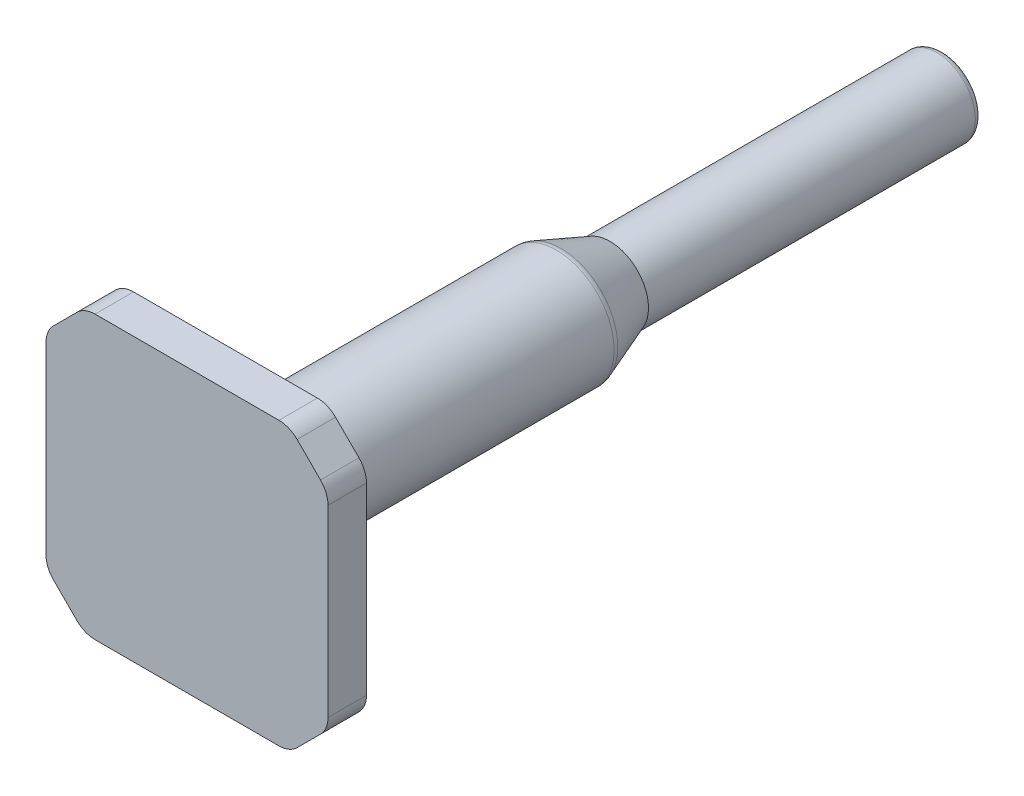
ISO-10303-21;
HEADER;
FILE_DESCRIPTION(('STEP AP214'),'2;1');
FILE_NAME('part.step','',(''),(''),'','','');
FILE_SCHEMA(('AUTOMOTIVE_DESIGN { 1 0 10303 214 1 1 1 1 }'));
ENDSEC;
DATA;
#1=APPLICATION_CONTEXT('core data for automotive mechanical design processes');
#2=APPLICATION_PROTOCOL_DEFINITION('international standard','automotive_design',2000,#1);
#3=PRODUCT_CONTEXT('',#1,'mechanical');
#4=PRODUCT('Part','Part','',(#3));
#5=PRODUCT_RELATED_PRODUCT_CATEGORY('part','',(#4));
#6=PRODUCT_DEFINITION_FORMATION('','',#4);
#7=PRODUCT_DEFINITION_CONTEXT('part definition',#1,'design');
#8=PRODUCT_DEFINITION('design','',#6,#7);
#9=PRODUCT_DEFINITION_SHAPE('','',#8);
#10=(LENGTH_UNIT() NAMED_UNIT(*) SI_UNIT(.MILLI.,.METRE.));
#11=(NAMED_UNIT(*) PLANE_ANGLE_UNIT() SI_UNIT($,.RADIAN.));
#12=(NAMED_UNIT(*) SI_UNIT($,.STERADIAN.) SOLID_ANGLE_UNIT());
#13=UNCERTAINTY_MEASURE_WITH_UNIT(LENGTH_MEASURE(1.E-05),#10,'distance_accuracy_value','');
#14=(GEOMETRIC_REPRESENTATION_CONTEXT(3) GLOBAL_UNCERTAINTY_ASSIGNED_CONTEXT((#13)) GLOBAL_UNIT_ASSIGNED_CONTEXT((#10,
#11,#12)) REPRESENTATION_CONTEXT('',''));
#15=CARTESIAN_POINT('',(0.,0.,0.));
#16=DIRECTION('',(0.,0.,1.));
#17=DIRECTION('',(1.,0.,0.));
#18=AXIS2_PLACEMENT_3D('',#15,#16,#17);
#19=CARTESIAN_POINT('',(0.,0.,0.));
#20=DIRECTION('',(0.,0.,1.));
#21=DIRECTION('',(1.,0.,0.));
#22=AXIS2_PLACEMENT_3D('',#19,#20,#21);
#23=PLANE('',#22);
#24=CARTESIAN_POINT('',(0.,0.,0.));
#25=DIRECTION('',(0.,0.,1.));
#26=DIRECTION('',(1.,0.,0.));
#27=AXIS2_PLACEMENT_3D('',#24,#25,#26);
#28=CIRCLE('',#27,5.);
#29=CARTESIAN_POINT('',(5.,0.,0.));
#30=VERTEX_POINT('',#29);
#31=EDGE_CURVE('E245',#30,#30,#28,.T.);
#32=ORIENTED_EDGE('',*,*,#31,.T.);
#33=EDGE_LOOP('',(#32));
#34=FACE_BOUND('',#33,.T.);
#35=DIRECTION('',(-0.707106781186549,-0.707106781186547,0.));
#36=VECTOR('',#35,1.);
#37=CARTESIAN_POINT('',(11.,-8.,0.));
#38=LINE('',#37,#36);
#39=CARTESIAN_POINT('',(10.4142135623731,-8.5857864376269,0.));
#40=VERTEX_POINT('',#39);
#41=CARTESIAN_POINT('',(8.5857864376269,-10.4142135623731,0.));
#42=VERTEX_POINT('',#41);
#43=EDGE_CURVE('E408',#40,#42,#38,.T.);
#44=ORIENTED_EDGE('',*,*,#43,.T.);
#45=CARTESIAN_POINT('',(7.17157287525381,-9.,0.));
#46=DIRECTION('',(0.,0.,1.));
#47=DIRECTION('',(1.,0.,0.));
#48=AXIS2_PLACEMENT_3D('',#45,#46,#47);
#49=CIRCLE('',#48,2.);
#50=CARTESIAN_POINT('',(7.17157287525381,-11.,0.));
#51=VERTEX_POINT('',#50);
#52=EDGE_CURVE('E306',#42,#51,#49,.F.);
#53=ORIENTED_EDGE('',*,*,#52,.T.);
#54=DIRECTION('',(1.,0.,0.));
#55=VECTOR('',#54,1.);
#56=CARTESIAN_POINT('',(0.,-11.,0.));
#57=LINE('',#56,#55);
#58=CARTESIAN_POINT('',(-7.1715728752538,-11.,0.));
#59=VERTEX_POINT('',#58);
#60=EDGE_CURVE('E376',#59,#51,#57,.T.);
#61=ORIENTED_EDGE('',*,*,#60,.F.);
#62=CARTESIAN_POINT('',(-7.1715728752538,-9.,0.));
#63=DIRECTION('',(0.,0.,1.));
#64=DIRECTION('',(1.,0.,0.));
#65=AXIS2_PLACEMENT_3D('',#62,#63,#64);
#66=CIRCLE('',#65,2.);
#67=CARTESIAN_POINT('',(-8.5857864376269,-10.4142135623731,0.));
#68=VERTEX_POINT('',#67);
#69=EDGE_CURVE('E249',#59,#68,#66,.F.);
#70=ORIENTED_EDGE('',*,*,#69,.T.);
#71=DIRECTION('',(0.707106781186547,-0.707106781186548,0.));
#72=VECTOR('',#71,1.);
#73=CARTESIAN_POINT('',(-7.99999999999999,-11.,0.));
#74=LINE('',#73,#72);
#75=CARTESIAN_POINT('',(-10.4142135623731,-8.58578643762688,0.));
#76=VERTEX_POINT('',#75);
#77=EDGE_CURVE('E411',#68,#76,#74,.F.);
#78=ORIENTED_EDGE('',*,*,#77,.T.);
#79=CARTESIAN_POINT('',(-9.,-7.17157287525379,0.));
#80=DIRECTION('',(0.,0.,1.));
#81=DIRECTION('',(1.,0.,0.));
#82=AXIS2_PLACEMENT_3D('',#79,#80,#81);
#83=CIRCLE('',#82,2.);
#84=CARTESIAN_POINT('',(-11.,-7.17157287525379,0.));
#85=VERTEX_POINT('',#84);
#86=EDGE_CURVE('E300',#76,#85,#83,.F.);
#87=ORIENTED_EDGE('',*,*,#86,.T.);
#88=DIRECTION('',(0.,-1.,0.));
#89=VECTOR('',#88,1.);
#90=CARTESIAN_POINT('',(-11.,0.,0.));
#91=LINE('',#90,#89);
#92=CARTESIAN_POINT('',(-11.,7.17157287525382,0.));
#93=VERTEX_POINT('',#92);
#94=EDGE_CURVE('E369',#93,#85,#91,.T.);
#95=ORIENTED_EDGE('',*,*,#94,.F.);
#96=CARTESIAN_POINT('',(-9.,7.17157287525382,0.));
#97=DIRECTION('',(0.,0.,1.));
#98=DIRECTION('',(1.,0.,0.));
#99=AXIS2_PLACEMENT_3D('',#96,#97,#98);
#100=CIRCLE('',#99,2.);
#101=CARTESIAN_POINT('',(-10.4142135623731,8.58578643762691,0.));
#102=VERTEX_POINT('',#101);
#103=EDGE_CURVE('E130',#93,#102,#100,.F.);
#104=ORIENTED_EDGE('',*,*,#103,.T.);
#105=DIRECTION('',(0.707106781186548,0.707106781186547,0.));
#106=VECTOR('',#105,1.);
#107=CARTESIAN_POINT('',(-11.,8.00000000000001,0.));
#108=LINE('',#107,#106);
#109=CARTESIAN_POINT('',(-8.5857864376269,10.4142135623731,0.));
#110=VERTEX_POINT('',#109);
#111=EDGE_CURVE('E415',#102,#110,#108,.T.);
#112=ORIENTED_EDGE('',*,*,#111,.T.);
#113=CARTESIAN_POINT('',(-7.17157287525381,9.,0.));
#114=DIRECTION('',(0.,0.,1.));
#115=DIRECTION('',(1.,0.,0.));
#116=AXIS2_PLACEMENT_3D('',#113,#114,#115);
#117=CIRCLE('',#116,2.);
#118=CARTESIAN_POINT('',(-7.17157287525381,11.,0.));
#119=VERTEX_POINT('',#118);
#120=EDGE_CURVE('E293',#110,#119,#117,.F.);
#121=ORIENTED_EDGE('',*,*,#120,.T.);
#122=DIRECTION('',(1.,0.,0.));
#123=VECTOR('',#122,1.);
#124=CARTESIAN_POINT('',(0.,11.,0.));
#125=LINE('',#124,#123);
#126=CARTESIAN_POINT('',(7.17157287525382,11.,0.));
#127=VERTEX_POINT('',#126);
#128=EDGE_CURVE('E363',#119,#127,#125,.T.);
#129=ORIENTED_EDGE('',*,*,#128,.T.);
#130=CARTESIAN_POINT('',(7.17157287525382,9.,0.));
#131=DIRECTION('',(0.,0.,1.));
#132=DIRECTION('',(1.,0.,0.));
#133=AXIS2_PLACEMENT_3D('',#130,#131,#132);
#134=CIRCLE('',#133,2.);
#135=CARTESIAN_POINT('',(8.58578643762692,10.4142135623731,0.));
#136=VERTEX_POINT('',#135);
#137=EDGE_CURVE('E287',#127,#136,#134,.F.);
#138=ORIENTED_EDGE('',*,*,#137,.T.);
#139=DIRECTION('',(-0.707106781186546,0.707106781186549,0.));
#140=VECTOR('',#139,1.);
#141=CARTESIAN_POINT('',(8.00000000000002,11.,0.));
#142=LINE('',#141,#140);
#143=CARTESIAN_POINT('',(10.4142135623731,8.58578643762691,0.));
#144=VERTEX_POINT('',#143);
#145=EDGE_CURVE('E352',#136,#144,#142,.F.);
#146=ORIENTED_EDGE('',*,*,#145,.T.);
#147=CARTESIAN_POINT('',(9.,7.17157287525382,0.));
#148=DIRECTION('',(0.,0.,1.));
#149=DIRECTION('',(1.,0.,0.));
#150=AXIS2_PLACEMENT_3D('',#147,#148,#149);
#151=CIRCLE('',#150,2.);
#152=CARTESIAN_POINT('',(11.,7.17157287525382,0.));
#153=VERTEX_POINT('',#152);
#154=EDGE_CURVE('E290',#144,#153,#151,.F.);
#155=ORIENTED_EDGE('',*,*,#154,.T.);
#156=DIRECTION('',(0.,-1.,0.));
#157=VECTOR('',#156,1.);
#158=CARTESIAN_POINT('',(11.,0.,0.));
#159=LINE('',#158,#157);
#160=CARTESIAN_POINT('',(11.,-7.17157287525381,0.));
#161=VERTEX_POINT('',#160);
#162=EDGE_CURVE('E370',#153,#161,#159,.T.);
#163=ORIENTED_EDGE('',*,*,#162,.T.);
#164=CARTESIAN_POINT('',(9.,-7.17157287525381,0.));
#165=DIRECTION('',(0.,0.,1.));
#166=DIRECTION('',(1.,0.,0.));
#167=AXIS2_PLACEMENT_3D('',#164,#165,#166);
#168=CIRCLE('',#167,2.);
#169=EDGE_CURVE('E303',#161,#40,#168,.F.);
#170=ORIENTED_EDGE('',*,*,#169,.T.);
#171=EDGE_LOOP('',(#44,#53,#61,#70,#78,#87,#95,#104,#112,#121,#129,#138,#146,#155,#163,#170));
#172=FACE_BOUND('',#171,.T.);
#173=ADVANCED_FACE('F107',(#34,#172),#23,.F.);
#174=CARTESIAN_POINT('',(0.,11.,3.));
#175=DIRECTION('',(0.,1.,0.));
#176=DIRECTION('',(0.,0.,1.));
#177=AXIS2_PLACEMENT_3D('',#174,#175,#176);
#178=PLANE('',#177);
#179=ORIENTED_EDGE('',*,*,#128,.F.);
#180=DIRECTION('',(0.,0.,1.));
#181=VECTOR('',#180,1.);
#182=CARTESIAN_POINT('',(-7.17157287525381,11.,3.));
#183=LINE('',#182,#181);
#184=CARTESIAN_POINT('',(-7.17157287525381,11.,3.));
#185=VERTEX_POINT('',#184);
#186=EDGE_CURVE('E340',#119,#185,#183,.T.);
#187=ORIENTED_EDGE('',*,*,#186,.T.);
#188=DIRECTION('',(1.,0.,0.));
#189=VECTOR('',#188,1.);
#190=CARTESIAN_POINT('',(0.,11.,3.));
#191=LINE('',#190,#189);
#192=CARTESIAN_POINT('',(7.17157287525382,11.,3.));
#193=VERTEX_POINT('',#192);
#194=EDGE_CURVE('E365',#185,#193,#191,.T.);
#195=ORIENTED_EDGE('',*,*,#194,.T.);
#196=DIRECTION('',(0.,0.,1.));
#197=VECTOR('',#196,1.);
#198=CARTESIAN_POINT('',(7.17157287525382,11.,3.));
#199=LINE('',#198,#197);
#200=EDGE_CURVE('E336',#193,#127,#199,.F.);
#201=ORIENTED_EDGE('',*,*,#200,.T.);
#202=EDGE_LOOP('',(#179,#187,#195,#201));
#203=FACE_BOUND('',#202,.T.);
#204=ADVANCED_FACE('F362',(#203),#178,.T.);
#205=CARTESIAN_POINT('',(-11.,0.,3.));
#206=DIRECTION('',(1.,0.,0.));
#207=DIRECTION('',(0.,1.,0.));
#208=AXIS2_PLACEMENT_3D('',#205,#206,#207);
#209=PLANE('',#208);
#210=ORIENTED_EDGE('',*,*,#94,.T.);
#211=DIRECTION('',(0.,0.,-1.));
#212=VECTOR('',#211,1.);
#213=CARTESIAN_POINT('',(-11.,-7.17157287525379,3.));
#214=LINE('',#213,#212);
#215=CARTESIAN_POINT('',(-11.,-7.17157287525379,3.));
#216=VERTEX_POINT('',#215);
#217=EDGE_CURVE('E321',#85,#216,#214,.F.);
#218=ORIENTED_EDGE('',*,*,#217,.T.);
#219=DIRECTION('',(0.,-1.,0.));
#220=VECTOR('',#219,1.);
#221=CARTESIAN_POINT('',(-11.,0.,3.));
#222=LINE('',#221,#220);
#223=CARTESIAN_POINT('',(-11.,7.17157287525382,3.));
#224=VERTEX_POINT('',#223);
#225=EDGE_CURVE('E246',#224,#216,#222,.T.);
#226=ORIENTED_EDGE('',*,*,#225,.F.);
#227=DIRECTION('',(0.,0.,-1.));
#228=VECTOR('',#227,1.);
#229=CARTESIAN_POINT('',(-11.,7.17157287525382,0.));
#230=LINE('',#229,#228);
#231=EDGE_CURVE('E317',#224,#93,#230,.T.);
#232=ORIENTED_EDGE('',*,*,#231,.T.);
#233=EDGE_LOOP('',(#210,#218,#226,#232));
#234=FACE_BOUND('',#233,.T.);
#235=ADVANCED_FACE('F436',(#234),#209,.F.);
#236=CARTESIAN_POINT('',(0.,-11.,3.));
#237=DIRECTION('',(0.,1.,0.));
#238=DIRECTION('',(0.,0.,1.));
#239=AXIS2_PLACEMENT_3D('',#236,#237,#238);
#240=PLANE('',#239);
#241=ORIENTED_EDGE('',*,*,#60,.T.);
#242=DIRECTION('',(0.,0.,1.));
#243=VECTOR('',#242,1.);
#244=CARTESIAN_POINT('',(7.17157287525381,-11.,3.));
#245=LINE('',#244,#243);
#246=CARTESIAN_POINT('',(7.17157287525381,-11.,3.));
#247=VERTEX_POINT('',#246);
#248=EDGE_CURVE('E243',#51,#247,#245,.T.);
#249=ORIENTED_EDGE('',*,*,#248,.T.);
#250=DIRECTION('',(1.,0.,0.));
#251=VECTOR('',#250,1.);
#252=CARTESIAN_POINT('',(0.,-11.,3.));
#253=LINE('',#252,#251);
#254=CARTESIAN_POINT('',(-7.1715728752538,-11.,3.));
#255=VERTEX_POINT('',#254);
#256=EDGE_CURVE('E225',#255,#247,#253,.T.);
#257=ORIENTED_EDGE('',*,*,#256,.F.);
#258=DIRECTION('',(0.,0.,1.));
#259=VECTOR('',#258,1.);
#260=CARTESIAN_POINT('',(-7.1715728752538,-11.,0.));
#261=LINE('',#260,#259);
#262=EDGE_CURVE('E240',#255,#59,#261,.F.);
#263=ORIENTED_EDGE('',*,*,#262,.T.);
#264=EDGE_LOOP('',(#241,#249,#257,#263));
#265=FACE_BOUND('',#264,.T.);
#266=ADVANCED_FACE('F239',(#265),#240,.F.);
#267=CARTESIAN_POINT('',(11.,0.,3.));
#268=DIRECTION('',(1.,0.,0.));
#269=DIRECTION('',(0.,1.,0.));
#270=AXIS2_PLACEMENT_3D('',#267,#268,#269);
#271=PLANE('',#270);
#272=DIRECTION('',(0.,-1.,0.));
#273=VECTOR('',#272,1.);
#274=CARTESIAN_POINT('',(11.,0.,3.));
#275=LINE('',#274,#273);
#276=CARTESIAN_POINT('',(11.,7.17157287525382,3.));
#277=VERTEX_POINT('',#276);
#278=CARTESIAN_POINT('',(11.,-7.17157287525381,3.));
#279=VERTEX_POINT('',#278);
#280=EDGE_CURVE('E384',#277,#279,#275,.T.);
#281=ORIENTED_EDGE('',*,*,#280,.T.);
#282=DIRECTION('',(0.,0.,-1.));
#283=VECTOR('',#282,1.);
#284=CARTESIAN_POINT('',(11.,-7.17157287525381,3.));
#285=LINE('',#284,#283);
#286=EDGE_CURVE('E313',#279,#161,#285,.T.);
#287=ORIENTED_EDGE('',*,*,#286,.T.);
#288=ORIENTED_EDGE('',*,*,#162,.F.);
#289=DIRECTION('',(0.,0.,-1.));
#290=VECTOR('',#289,1.);
#291=CARTESIAN_POINT('',(11.,7.17157287525382,3.));
#292=LINE('',#291,#290);
#293=EDGE_CURVE('E309',#153,#277,#292,.F.);
#294=ORIENTED_EDGE('',*,*,#293,.T.);
#295=EDGE_LOOP('',(#281,#287,#288,#294));
#296=FACE_BOUND('',#295,.T.);
#297=ADVANCED_FACE('F474',(#296),#271,.T.);
#298=CARTESIAN_POINT('',(0.,0.,3.));
#299=DIRECTION('',(0.,0.,1.));
#300=DIRECTION('',(1.,0.,0.));
#301=AXIS2_PLACEMENT_3D('',#298,#299,#300);
#302=PLANE('',#301);
#303=ORIENTED_EDGE('',*,*,#256,.T.);
#304=CARTESIAN_POINT('',(7.17157287525381,-9.,3.));
#305=DIRECTION('',(0.,0.,1.));
#306=DIRECTION('',(1.,0.,0.));
#307=AXIS2_PLACEMENT_3D('',#304,#305,#306);
#308=CIRCLE('',#307,2.);
#309=CARTESIAN_POINT('',(8.5857864376269,-10.4142135623731,3.));
#310=VERTEX_POINT('',#309);
#311=EDGE_CURVE('E278',#247,#310,#308,.T.);
#312=ORIENTED_EDGE('',*,*,#311,.T.);
#313=DIRECTION('',(0.707106781186549,0.707106781186547,0.));
#314=VECTOR('',#313,1.);
#315=CARTESIAN_POINT('',(9.49999999999999,-9.50000000000002,3.));
#316=LINE('',#315,#314);
#317=CARTESIAN_POINT('',(10.4142135623731,-8.58578643762691,3.));
#318=VERTEX_POINT('',#317);
#319=EDGE_CURVE('E420',#310,#318,#316,.T.);
#320=ORIENTED_EDGE('',*,*,#319,.T.);
#321=CARTESIAN_POINT('',(9.,-7.17157287525381,3.));
#322=DIRECTION('',(0.,0.,1.));
#323=DIRECTION('',(1.,0.,0.));
#324=AXIS2_PLACEMENT_3D('',#321,#322,#323);
#325=CIRCLE('',#324,2.);
#326=EDGE_CURVE('E275',#318,#279,#325,.T.);
#327=ORIENTED_EDGE('',*,*,#326,.T.);
#328=ORIENTED_EDGE('',*,*,#280,.F.);
#329=CARTESIAN_POINT('',(9.,7.17157287525382,3.));
#330=DIRECTION('',(0.,0.,1.));
#331=DIRECTION('',(1.,0.,0.));
#332=AXIS2_PLACEMENT_3D('',#329,#330,#331);
#333=CIRCLE('',#332,2.);
#334=CARTESIAN_POINT('',(10.4142135623731,8.58578643762691,3.));
#335=VERTEX_POINT('',#334);
#336=EDGE_CURVE('E265',#277,#335,#333,.T.);
#337=ORIENTED_EDGE('',*,*,#336,.T.);
#338=DIRECTION('',(0.707106781186546,-0.707106781186549,0.));
#339=VECTOR('',#338,1.);
#340=CARTESIAN_POINT('',(9.50000000000003,9.49999999999998,3.));
#341=LINE('',#340,#339);
#342=CARTESIAN_POINT('',(8.58578643762692,10.4142135623731,3.));
#343=VERTEX_POINT('',#342);
#344=EDGE_CURVE('E251',#335,#343,#341,.F.);
#345=ORIENTED_EDGE('',*,*,#344,.T.);
#346=CARTESIAN_POINT('',(7.17157287525382,9.,3.));
#347=DIRECTION('',(0.,0.,1.));
#348=DIRECTION('',(1.,0.,0.));
#349=AXIS2_PLACEMENT_3D('',#346,#347,#348);
#350=CIRCLE('',#349,2.);
#351=EDGE_CURVE('E256',#343,#193,#350,.T.);
#352=ORIENTED_EDGE('',*,*,#351,.T.);
#353=ORIENTED_EDGE('',*,*,#194,.F.);
#354=CARTESIAN_POINT('',(-7.17157287525381,9.,3.));
#355=DIRECTION('',(0.,0.,1.));
#356=DIRECTION('',(1.,0.,0.));
#357=AXIS2_PLACEMENT_3D('',#354,#355,#356);
#358=CIRCLE('',#357,2.);
#359=CARTESIAN_POINT('',(-8.5857864376269,10.4142135623731,3.));
#360=VERTEX_POINT('',#359);
#361=EDGE_CURVE('E268',#185,#360,#358,.T.);
#362=ORIENTED_EDGE('',*,*,#361,.T.);
#363=DIRECTION('',(-0.707106781186548,-0.707106781186547,0.));
#364=VECTOR('',#363,1.);
#365=CARTESIAN_POINT('',(-9.49999999999999,9.50000000000001,3.));
#366=LINE('',#365,#364);
#367=CARTESIAN_POINT('',(-10.4142135623731,8.58578643762691,3.));
#368=VERTEX_POINT('',#367);
#369=EDGE_CURVE('E259',#360,#368,#366,.T.);
#370=ORIENTED_EDGE('',*,*,#369,.T.);
#371=CARTESIAN_POINT('',(-9.,7.17157287525382,3.));
#372=DIRECTION('',(0.,0.,1.));
#373=DIRECTION('',(1.,0.,0.));
#374=AXIS2_PLACEMENT_3D('',#371,#372,#373);
#375=CIRCLE('',#374,2.);
#376=EDGE_CURVE('E233',#368,#224,#375,.T.);
#377=ORIENTED_EDGE('',*,*,#376,.T.);
#378=ORIENTED_EDGE('',*,*,#225,.T.);
#379=CARTESIAN_POINT('',(-9.,-7.17157287525379,3.));
#380=DIRECTION('',(0.,0.,1.));
#381=DIRECTION('',(1.,0.,0.));
#382=AXIS2_PLACEMENT_3D('',#379,#380,#381);
#383=CIRCLE('',#382,2.);
#384=CARTESIAN_POINT('',(-10.4142135623731,-8.58578643762688,3.));
#385=VERTEX_POINT('',#384);
#386=EDGE_CURVE('E232',#216,#385,#383,.T.);
#387=ORIENTED_EDGE('',*,*,#386,.T.);
#388=DIRECTION('',(-0.707106781186547,0.707106781186548,0.));
#389=VECTOR('',#388,1.);
#390=CARTESIAN_POINT('',(-9.5,-9.49999999999998,3.));
#391=LINE('',#390,#389);
#392=CARTESIAN_POINT('',(-8.5857864376269,-10.4142135623731,3.));
#393=VERTEX_POINT('',#392);
#394=EDGE_CURVE('E227',#385,#393,#391,.F.);
#395=ORIENTED_EDGE('',*,*,#394,.T.);
#396=CARTESIAN_POINT('',(-7.1715728752538,-9.,3.));
#397=DIRECTION('',(0.,0.,1.));
#398=DIRECTION('',(1.,0.,0.));
#399=AXIS2_PLACEMENT_3D('',#396,#397,#398);
#400=CIRCLE('',#399,2.);
#401=EDGE_CURVE('E222',#393,#255,#400,.T.);
#402=ORIENTED_EDGE('',*,*,#401,.T.);
#403=EDGE_LOOP('',(#303,#312,#320,#327,#328,#337,#345,#352,#353,#362,#370,#377,#378,#387,#395,#402));
#404=FACE_BOUND('',#403,.T.);
#405=ADVANCED_FACE('F224',(#404),#302,.T.);
#406=CARTESIAN_POINT('',(0.,0.,-30.));
#407=DIRECTION('',(0.,0.,1.));
#408=DIRECTION('',(1.,0.,0.));
#409=AXIS2_PLACEMENT_3D('',#406,#407,#408);
#410=CYLINDRICAL_SURFACE('',#409,4.5);
#411=CARTESIAN_POINT('',(0.,0.,-25.8186654182275));
#412=DIRECTION('',(0.,0.,1.));
#413=DIRECTION('',(0.,-1.,0.));
#414=AXIS2_PLACEMENT_3D('',#411,#412,#413);
#415=CIRCLE('',#414,4.5);
#416=CARTESIAN_POINT('',(0.,-4.49999999999999,-25.8186654182275));
#417=VERTEX_POINT('',#416);
#418=EDGE_CURVE('E404',#417,#417,#415,.T.);
#419=ORIENTED_EDGE('',*,*,#418,.T.);
#420=EDGE_LOOP('',(#419));
#421=FACE_BOUND('',#420,.T.);
#422=CARTESIAN_POINT('',(0.,0.,-0.5));
#423=DIRECTION('',(0.,0.,1.));
#424=DIRECTION('',(1.,0.,0.));
#425=AXIS2_PLACEMENT_3D('',#422,#423,#424);
#426=CIRCLE('',#425,4.5);
#427=CARTESIAN_POINT('',(4.5,0.,-0.5));
#428=VERTEX_POINT('',#427);
#429=EDGE_CURVE('E388',#428,#428,#426,.F.);
#430=ORIENTED_EDGE('',*,*,#429,.T.);
#431=EDGE_LOOP('',(#430));
#432=FACE_BOUND('',#431,.T.);
#433=ADVANCED_FACE('F462',(#421,#432),#410,.T.);
#434=CARTESIAN_POINT('',(0.,0.,-26.));
#435=DIRECTION('',(0.,0.,1.));
#436=DIRECTION('',(0.,-1.,0.));
#437=AXIS2_PLACEMENT_3D('',#434,#435,#436);
#438=CONICAL_SURFACE('',#437,4.5,0.358770670270572);
#439=CARTESIAN_POINT('',(0.,0.,-26.1697888598159));
#440=DIRECTION('',(0.,0.,1.));
#441=DIRECTION('',(0.,-1.,0.));
#442=AXIS2_PLACEMENT_3D('',#439,#440,#441);
#443=CIRCLE('',#442,4.43632917756904);
#444=CARTESIAN_POINT('',(0.,-4.43632917756904,-26.1697888598159));
#445=VERTEX_POINT('',#444);
#446=EDGE_CURVE('E400',#445,#445,#443,.F.);
#447=ORIENTED_EDGE('',*,*,#446,.T.);
#448=EDGE_LOOP('',(#447));
#449=FACE_BOUND('',#448,.T.);
#450=CARTESIAN_POINT('',(0.,0.,-30.));
#451=DIRECTION('',(0.,0.,-1.));
#452=DIRECTION('',(0.,1.,0.));
#453=AXIS2_PLACEMENT_3D('',#450,#451,#452);
#454=CIRCLE('',#453,3.);
#455=CARTESIAN_POINT('',(3.,0.,-30.));
#456=VERTEX_POINT('',#455);
#457=EDGE_CURVE('E379',#456,#456,#454,.T.);
#458=ORIENTED_EDGE('',*,*,#457,.F.);
#459=EDGE_LOOP('',(#458));
#460=FACE_BOUND('',#459,.T.);
#461=ADVANCED_FACE('F459',(#449,#460),#438,.T.);
#462=CARTESIAN_POINT('',(0.,0.,-56.));
#463=DIRECTION('',(0.,0.,-1.));
#464=DIRECTION('',(-1.,0.,0.));
#465=AXIS2_PLACEMENT_3D('',#462,#463,#464);
#466=PLANE('',#465);
#467=CARTESIAN_POINT('',(0.,0.,-56.));
#468=DIRECTION('',(0.,0.,-1.));
#469=DIRECTION('',(-1.,0.,0.));
#470=AXIS2_PLACEMENT_3D('',#467,#468,#469);
#471=CIRCLE('',#470,2.5);
#472=CARTESIAN_POINT('',(-2.5,0.,-56.));
#473=VERTEX_POINT('',#472);
#474=EDGE_CURVE('E392',#473,#473,#471,.T.);
#475=ORIENTED_EDGE('',*,*,#474,.T.);
#476=EDGE_LOOP('',(#475));
#477=FACE_BOUND('',#476,.T.);
#478=ADVANCED_FACE('F461',(#477),#466,.T.);
#479=CARTESIAN_POINT('',(0.,0.,-56.));
#480=DIRECTION('',(0.,0.,1.));
#481=DIRECTION('',(1.,0.,0.));
#482=AXIS2_PLACEMENT_3D('',#479,#480,#481);
#483=CYLINDRICAL_SURFACE('',#482,3.);
#484=CARTESIAN_POINT('',(0.,0.,-55.5));
#485=DIRECTION('',(0.,0.,-1.));
#486=DIRECTION('',(-1.,0.,0.));
#487=AXIS2_PLACEMENT_3D('',#484,#485,#486);
#488=CIRCLE('',#487,3.);
#489=CARTESIAN_POINT('',(3.,0.,-55.5));
#490=VERTEX_POINT('',#489);
#491=EDGE_CURVE('E396',#490,#490,#488,.F.);
#492=CARTESIAN_POINT('',(3.,0.,-55.5));
#493=CARTESIAN_POINT('',(3.,0.,-55.234375));
#494=CARTESIAN_POINT('',(3.,0.,-54.96875));
#495=CARTESIAN_POINT('',(3.,0.,-54.4375));
#496=CARTESIAN_POINT('',(3.,0.,-54.171875));
#497=CARTESIAN_POINT('',(3.,0.,-53.640625));
#498=CARTESIAN_POINT('',(3.,0.,-53.375));
#499=CARTESIAN_POINT('',(3.,0.,-52.84375));
#500=CARTESIAN_POINT('',(3.,0.,-52.578125));
#501=CARTESIAN_POINT('',(3.,0.,-52.046875));
#502=CARTESIAN_POINT('',(3.,0.,-51.78125));
#503=CARTESIAN_POINT('',(3.,0.,-51.25));
#504=CARTESIAN_POINT('',(3.,0.,-50.984375));
#505=CARTESIAN_POINT('',(3.,0.,-50.453125));
#506=CARTESIAN_POINT('',(3.,0.,-50.1875));
#507=CARTESIAN_POINT('',(3.,0.,-49.65625));
#508=CARTESIAN_POINT('',(3.,0.,-49.390625));
#509=CARTESIAN_POINT('',(3.,0.,-48.859375));
#510=CARTESIAN_POINT('',(3.,0.,-48.59375));
#511=CARTESIAN_POINT('',(3.,0.,-48.0625));
#512=CARTESIAN_POINT('',(3.,0.,-47.796875));
#513=CARTESIAN_POINT('',(3.,0.,-47.265625));
#514=CARTESIAN_POINT('',(3.,0.,-47.));
#515=CARTESIAN_POINT('',(3.,0.,-46.46875));
#516=CARTESIAN_POINT('',(3.,0.,-46.203125));
#517=CARTESIAN_POINT('',(3.,0.,-45.671875));
#518=CARTESIAN_POINT('',(3.,0.,-45.40625));
#519=CARTESIAN_POINT('',(3.,0.,-44.875));
#520=CARTESIAN_POINT('',(3.,0.,-44.609375));
#521=CARTESIAN_POINT('',(3.,0.,-44.078125));
#522=CARTESIAN_POINT('',(3.,0.,-43.8125));
#523=CARTESIAN_POINT('',(3.,0.,-43.28125));
#524=CARTESIAN_POINT('',(3.,0.,-43.015625));
#525=CARTESIAN_POINT('',(3.,0.,-42.484375));
#526=CARTESIAN_POINT('',(3.,0.,-42.21875));
#527=CARTESIAN_POINT('',(3.,0.,-41.6875));
#528=CARTESIAN_POINT('',(3.,0.,-41.421875));
#529=CARTESIAN_POINT('',(3.,0.,-40.890625));
#530=CARTESIAN_POINT('',(3.,0.,-40.625));
#531=CARTESIAN_POINT('',(3.,0.,-40.09375));
#532=CARTESIAN_POINT('',(3.,0.,-39.828125));
#533=CARTESIAN_POINT('',(3.,0.,-39.296875));
#534=CARTESIAN_POINT('',(3.,0.,-39.03125));
#535=CARTESIAN_POINT('',(3.,0.,-38.5));
#536=CARTESIAN_POINT('',(3.,0.,-38.234375));
#537=CARTESIAN_POINT('',(3.,0.,-37.703125));
#538=CARTESIAN_POINT('',(3.,0.,-37.4375));
#539=CARTESIAN_POINT('',(3.,0.,-36.90625));
#540=CARTESIAN_POINT('',(3.,0.,-36.640625));
#541=CARTESIAN_POINT('',(3.,0.,-36.109375));
#542=CARTESIAN_POINT('',(3.,0.,-35.84375));
#543=CARTESIAN_POINT('',(3.,0.,-35.3125));
#544=CARTESIAN_POINT('',(3.,0.,-35.046875));
#545=CARTESIAN_POINT('',(3.,0.,-34.515625));
#546=CARTESIAN_POINT('',(3.,0.,-34.25));
#547=CARTESIAN_POINT('',(3.,0.,-33.71875));
#548=CARTESIAN_POINT('',(3.,0.,-33.453125));
#549=CARTESIAN_POINT('',(3.,0.,-32.921875));
#550=CARTESIAN_POINT('',(3.,0.,-32.65625));
#551=CARTESIAN_POINT('',(3.,0.,-32.125));
#552=CARTESIAN_POINT('',(3.,0.,-31.859375));
#553=CARTESIAN_POINT('',(3.,0.,-31.328125));
#554=CARTESIAN_POINT('',(3.,0.,-31.0625));
#555=CARTESIAN_POINT('',(3.,0.,-30.53125));
#556=CARTESIAN_POINT('',(3.,0.,-30.265625));
#557=CARTESIAN_POINT('',(3.,0.,-30.));
#558=B_SPLINE_CURVE_WITH_KNOTS('',3,(#492,#493,#494,#495,#496,#497,#498,#499,#500,#501,#502,
#503,#504,#505,#506,#507,#508,#509,#510,#511,#512,#513,#514,#515,#516,#517,#518,#519,#520,#521,
#522,#523,#524,#525,#526,#527,#528,#529,#530,#531,#532,#533,#534,#535,#536,#537,#538,#539,#540,
#541,#542,#543,#544,#545,#546,#547,#548,#549,#550,#551,#552,#553,#554,#555,#556,#557),
.UNSPECIFIED.,.F.,.F.,(4,2,2,2,2,2,2,2,2,2,2,2,2,2,2,2,2,2,2,2,2,2,2,2,2,2,2,2,2,2,2,2,4),(0.,
0.796874999999996,1.59375,2.39062499999999,3.1875,3.98437499999999,4.78124999999999,
5.57812499999999,6.37499999999999,7.17187499999999,7.96874999999999,8.76562499999999,
9.56249999999999,10.359375,11.15625,11.953125,12.75,13.546875,14.34375,15.140625,15.9375,
16.734375,17.53125,18.328125,19.125,19.921875,20.71875,21.515625,22.3125,23.109375,23.90625,
24.703125,25.5),.UNSPECIFIED.);
#559=EDGE_CURVE('BSEAM457',#490,#456,#558,.T.);
#560=ORIENTED_EDGE('',*,*,#491,.T.);
#561=ORIENTED_EDGE('',*,*,#457,.T.);
#562=ORIENTED_EDGE('',*,*,#559,.T.);
#563=ORIENTED_EDGE('',*,*,#559,.F.);
#564=EDGE_LOOP('',(#560,#562,#561,#563));
#565=FACE_BOUND('',#564,.T.);
#566=ADVANCED_FACE('F457',(#565),#483,.T.);
#567=CARTESIAN_POINT('',(0.,0.,-0.5));
#568=DIRECTION('',(0.,0.,1.));
#569=DIRECTION('',(1.,0.,0.));
#570=AXIS2_PLACEMENT_3D('',#567,#568,#569);
#571=TOROIDAL_SURFACE('',#570,5.,0.5);
#572=ORIENTED_EDGE('',*,*,#429,.F.);
#573=EDGE_LOOP('',(#572));
#574=FACE_BOUND('',#573,.T.);
#575=ORIENTED_EDGE('',*,*,#31,.F.);
#576=EDGE_LOOP('',(#575));
#577=FACE_BOUND('',#576,.T.);
#578=ADVANCED_FACE('F495',(#574,#577),#571,.F.);
#579=CARTESIAN_POINT('',(0.,0.,-55.5));
#580=DIRECTION('',(0.,0.,-1.));
#581=DIRECTION('',(-1.,0.,0.));
#582=AXIS2_PLACEMENT_3D('',#579,#580,#581);
#583=TOROIDAL_SURFACE('',#582,2.5,0.5);
#584=ORIENTED_EDGE('',*,*,#491,.F.);
#585=EDGE_LOOP('',(#584));
#586=FACE_BOUND('',#585,.T.);
#587=ORIENTED_EDGE('',*,*,#474,.F.);
#588=EDGE_LOOP('',(#587));
#589=FACE_BOUND('',#588,.T.);
#590=ADVANCED_FACE('F498',(#586,#589),#583,.T.);
#591=CARTESIAN_POINT('',(0.,0.,-25.8186654182275));
#592=DIRECTION('',(0.,0.,1.));
#593=DIRECTION('',(0.,-1.,0.));
#594=AXIS2_PLACEMENT_3D('',#591,#592,#593);
#595=TOROIDAL_SURFACE('',#594,3.5,1.);
#596=ORIENTED_EDGE('',*,*,#418,.F.);
#597=EDGE_LOOP('',(#596));
#598=FACE_BOUND('',#597,.T.);
#599=ORIENTED_EDGE('',*,*,#446,.F.);
#600=EDGE_LOOP('',(#599));
#601=FACE_BOUND('',#600,.T.);
#602=ADVANCED_FACE('F502',(#598,#601),#595,.T.);
#603=CARTESIAN_POINT('',(8.00000000000002,11.,3.));
#604=DIRECTION('',(-0.707106781186549,-0.707106781186546,0.));
#605=DIRECTION('',(0.,0.,-1.));
#606=AXIS2_PLACEMENT_3D('',#603,#604,#605);
#607=PLANE('',#606);
#608=ORIENTED_EDGE('',*,*,#344,.F.);
#609=DIRECTION('',(0.,0.,1.));
#610=VECTOR('',#609,1.);
#611=CARTESIAN_POINT('',(10.4142135623731,8.58578643762691,3.));
#612=LINE('',#611,#610);
#613=EDGE_CURVE('E12',#335,#144,#612,.F.);
#614=ORIENTED_EDGE('',*,*,#613,.T.);
#615=ORIENTED_EDGE('',*,*,#145,.F.);
#616=DIRECTION('',(0.,0.,-1.));
#617=VECTOR('',#616,1.);
#618=CARTESIAN_POINT('',(8.58578643762692,10.4142135623731,3.));
#619=LINE('',#618,#617);
#620=EDGE_CURVE('E116',#136,#343,#619,.F.);
#621=ORIENTED_EDGE('',*,*,#620,.T.);
#622=EDGE_LOOP('',(#608,#614,#615,#621));
#623=FACE_BOUND('',#622,.T.);
#624=ADVANCED_FACE('F349',(#623),#607,.F.);
#625=CARTESIAN_POINT('',(-11.,8.00000000000001,3.));
#626=DIRECTION('',(-0.707106781186547,0.707106781186548,0.));
#627=DIRECTION('',(0.,0.,1.));
#628=AXIS2_PLACEMENT_3D('',#625,#626,#627);
#629=PLANE('',#628);
#630=ORIENTED_EDGE('',*,*,#111,.F.);
#631=DIRECTION('',(0.,0.,-1.));
#632=VECTOR('',#631,1.);
#633=CARTESIAN_POINT('',(-10.4142135623731,8.58578643762691,3.));
#634=LINE('',#633,#632);
#635=EDGE_CURVE('E333',#102,#368,#634,.F.);
#636=ORIENTED_EDGE('',*,*,#635,.T.);
#637=ORIENTED_EDGE('',*,*,#369,.F.);
#638=DIRECTION('',(0.,0.,1.));
#639=VECTOR('',#638,1.);
#640=CARTESIAN_POINT('',(-8.5857864376269,10.4142135623731,3.));
#641=LINE('',#640,#639);
#642=EDGE_CURVE('E123',#360,#110,#641,.F.);
#643=ORIENTED_EDGE('',*,*,#642,.T.);
#644=EDGE_LOOP('',(#630,#636,#637,#643));
#645=FACE_BOUND('',#644,.T.);
#646=ADVANCED_FACE('F511',(#645),#629,.T.);
#647=CARTESIAN_POINT('',(-7.99999999999999,-11.,3.));
#648=DIRECTION('',(0.707106781186548,0.707106781186547,0.));
#649=DIRECTION('',(0.,0.,-1.));
#650=AXIS2_PLACEMENT_3D('',#647,#648,#649);
#651=PLANE('',#650);
#652=ORIENTED_EDGE('',*,*,#394,.F.);
#653=DIRECTION('',(0.,0.,1.));
#654=VECTOR('',#653,1.);
#655=CARTESIAN_POINT('',(-10.4142135623731,-8.58578643762688,0.));
#656=LINE('',#655,#654);
#657=EDGE_CURVE('E328',#385,#76,#656,.F.);
#658=ORIENTED_EDGE('',*,*,#657,.T.);
#659=ORIENTED_EDGE('',*,*,#77,.F.);
#660=DIRECTION('',(0.,0.,-1.));
#661=VECTOR('',#660,1.);
#662=CARTESIAN_POINT('',(-8.5857864376269,-10.4142135623731,3.));
#663=LINE('',#662,#661);
#664=EDGE_CURVE('E325',#68,#393,#663,.F.);
#665=ORIENTED_EDGE('',*,*,#664,.T.);
#666=EDGE_LOOP('',(#652,#658,#659,#665));
#667=FACE_BOUND('',#666,.T.);
#668=ADVANCED_FACE('F517',(#667),#651,.F.);
#669=CARTESIAN_POINT('',(11.,-8.,3.));
#670=DIRECTION('',(0.707106781186547,-0.707106781186549,0.));
#671=DIRECTION('',(0.,0.,1.));
#672=AXIS2_PLACEMENT_3D('',#669,#670,#671);
#673=PLANE('',#672);
#674=ORIENTED_EDGE('',*,*,#319,.F.);
#675=DIRECTION('',(0.,0.,1.));
#676=VECTOR('',#675,1.);
#677=CARTESIAN_POINT('',(8.5857864376269,-10.4142135623731,0.));
#678=LINE('',#677,#676);
#679=EDGE_CURVE('E284',#310,#42,#678,.F.);
#680=ORIENTED_EDGE('',*,*,#679,.T.);
#681=ORIENTED_EDGE('',*,*,#43,.F.);
#682=DIRECTION('',(0.,0.,-1.));
#683=VECTOR('',#682,1.);
#684=CARTESIAN_POINT('',(10.4142135623731,-8.5857864376269,3.));
#685=LINE('',#684,#683);
#686=EDGE_CURVE('E281',#40,#318,#685,.F.);
#687=ORIENTED_EDGE('',*,*,#686,.T.);
#688=EDGE_LOOP('',(#674,#680,#681,#687));
#689=FACE_BOUND('',#688,.T.);
#690=ADVANCED_FACE('F523',(#689),#673,.T.);
#691=CARTESIAN_POINT('',(7.17157287525381,-9.,3.));
#692=DIRECTION('',(0.,0.,-1.));
#693=DIRECTION('',(-1.,0.,0.));
#694=AXIS2_PLACEMENT_3D('',#691,#692,#693);
#695=CYLINDRICAL_SURFACE('',#694,2.);
#696=ORIENTED_EDGE('',*,*,#52,.F.);
#697=ORIENTED_EDGE('',*,*,#679,.F.);
#698=ORIENTED_EDGE('',*,*,#311,.F.);
#699=ORIENTED_EDGE('',*,*,#248,.F.);
#700=EDGE_LOOP('',(#696,#697,#698,#699));
#701=FACE_BOUND('',#700,.T.);
#702=ADVANCED_FACE('F529',(#701),#695,.T.);
#703=CARTESIAN_POINT('',(9.,-7.17157287525381,3.));
#704=DIRECTION('',(0.,0.,-1.));
#705=DIRECTION('',(-1.,0.,0.));
#706=AXIS2_PLACEMENT_3D('',#703,#704,#705);
#707=CYLINDRICAL_SURFACE('',#706,2.);
#708=ORIENTED_EDGE('',*,*,#326,.F.);
#709=ORIENTED_EDGE('',*,*,#686,.F.);
#710=ORIENTED_EDGE('',*,*,#169,.F.);
#711=ORIENTED_EDGE('',*,*,#286,.F.);
#712=EDGE_LOOP('',(#708,#709,#710,#711));
#713=FACE_BOUND('',#712,.T.);
#714=ADVANCED_FACE('F533',(#713),#707,.T.);
#715=CARTESIAN_POINT('',(-9.,-7.17157287525379,3.));
#716=DIRECTION('',(0.,0.,1.));
#717=DIRECTION('',(1.,0.,0.));
#718=AXIS2_PLACEMENT_3D('',#715,#716,#717);
#719=CYLINDRICAL_SURFACE('',#718,2.);
#720=ORIENTED_EDGE('',*,*,#86,.F.);
#721=ORIENTED_EDGE('',*,*,#657,.F.);
#722=ORIENTED_EDGE('',*,*,#386,.F.);
#723=ORIENTED_EDGE('',*,*,#217,.F.);
#724=EDGE_LOOP('',(#720,#721,#722,#723));
#725=FACE_BOUND('',#724,.T.);
#726=ADVANCED_FACE('F442',(#725),#719,.T.);
#727=CARTESIAN_POINT('',(-7.1715728752538,-9.,3.));
#728=DIRECTION('',(0.,0.,-1.));
#729=DIRECTION('',(-1.,0.,0.));
#730=AXIS2_PLACEMENT_3D('',#727,#728,#729);
#731=CYLINDRICAL_SURFACE('',#730,2.);
#732=ORIENTED_EDGE('',*,*,#401,.F.);
#733=ORIENTED_EDGE('',*,*,#664,.F.);
#734=ORIENTED_EDGE('',*,*,#69,.F.);
#735=ORIENTED_EDGE('',*,*,#262,.F.);
#736=EDGE_LOOP('',(#732,#733,#734,#735));
#737=FACE_BOUND('',#736,.T.);
#738=ADVANCED_FACE('F248',(#737),#731,.T.);
#739=CARTESIAN_POINT('',(-9.,7.17157287525382,3.));
#740=DIRECTION('',(0.,0.,1.));
#741=DIRECTION('',(1.,0.,0.));
#742=AXIS2_PLACEMENT_3D('',#739,#740,#741);
#743=CYLINDRICAL_SURFACE('',#742,2.);
#744=ORIENTED_EDGE('',*,*,#376,.F.);
#745=ORIENTED_EDGE('',*,*,#635,.F.);
#746=ORIENTED_EDGE('',*,*,#103,.F.);
#747=ORIENTED_EDGE('',*,*,#231,.F.);
#748=EDGE_LOOP('',(#744,#745,#746,#747));
#749=FACE_BOUND('',#748,.T.);
#750=ADVANCED_FACE('F434',(#749),#743,.T.);
#751=CARTESIAN_POINT('',(-7.17157287525381,9.,3.));
#752=DIRECTION('',(0.,0.,1.));
#753=DIRECTION('',(1.,0.,0.));
#754=AXIS2_PLACEMENT_3D('',#751,#752,#753);
#755=CYLINDRICAL_SURFACE('',#754,2.);
#756=ORIENTED_EDGE('',*,*,#120,.F.);
#757=ORIENTED_EDGE('',*,*,#642,.F.);
#758=ORIENTED_EDGE('',*,*,#361,.F.);
#759=ORIENTED_EDGE('',*,*,#186,.F.);
#760=EDGE_LOOP('',(#756,#757,#758,#759));
#761=FACE_BOUND('',#760,.T.);
#762=ADVANCED_FACE('F544',(#761),#755,.T.);
#763=CARTESIAN_POINT('',(9.,7.17157287525382,3.));
#764=DIRECTION('',(0.,0.,-1.));
#765=DIRECTION('',(-1.,0.,0.));
#766=AXIS2_PLACEMENT_3D('',#763,#764,#765);
#767=CYLINDRICAL_SURFACE('',#766,2.);
#768=ORIENTED_EDGE('',*,*,#154,.F.);
#769=ORIENTED_EDGE('',*,*,#613,.F.);
#770=ORIENTED_EDGE('',*,*,#336,.F.);
#771=ORIENTED_EDGE('',*,*,#293,.F.);
#772=EDGE_LOOP('',(#768,#769,#770,#771));
#773=FACE_BOUND('',#772,.T.);
#774=ADVANCED_FACE('F546',(#773),#767,.T.);
#775=CARTESIAN_POINT('',(7.17157287525382,9.,3.));
#776=DIRECTION('',(0.,0.,1.));
#777=DIRECTION('',(1.,0.,0.));
#778=AXIS2_PLACEMENT_3D('',#775,#776,#777);
#779=CYLINDRICAL_SURFACE('',#778,2.);
#780=ORIENTED_EDGE('',*,*,#351,.F.);
#781=ORIENTED_EDGE('',*,*,#620,.F.);
#782=ORIENTED_EDGE('',*,*,#137,.F.);
#783=ORIENTED_EDGE('',*,*,#200,.F.);
#784=EDGE_LOOP('',(#780,#781,#782,#783));
#785=FACE_BOUND('',#784,.T.);
#786=ADVANCED_FACE('F109',(#785),#779,.T.);
#787=CLOSED_SHELL('',(#173,#204,#235,#266,#297,#405,#433,#461,#478,#566,#578,#590,#602,#624,
#646,#668,#690,#702,#714,#726,#738,#750,#762,#774,#786));
#788=MANIFOLD_SOLID_BREP('B2',#787);
#789=ADVANCED_BREP_SHAPE_REPRESENTATION('',(#18,#788),#14);
#790=SHAPE_DEFINITION_REPRESENTATION(#9,#789);
ENDSEC;
END-ISO-10303-21;
